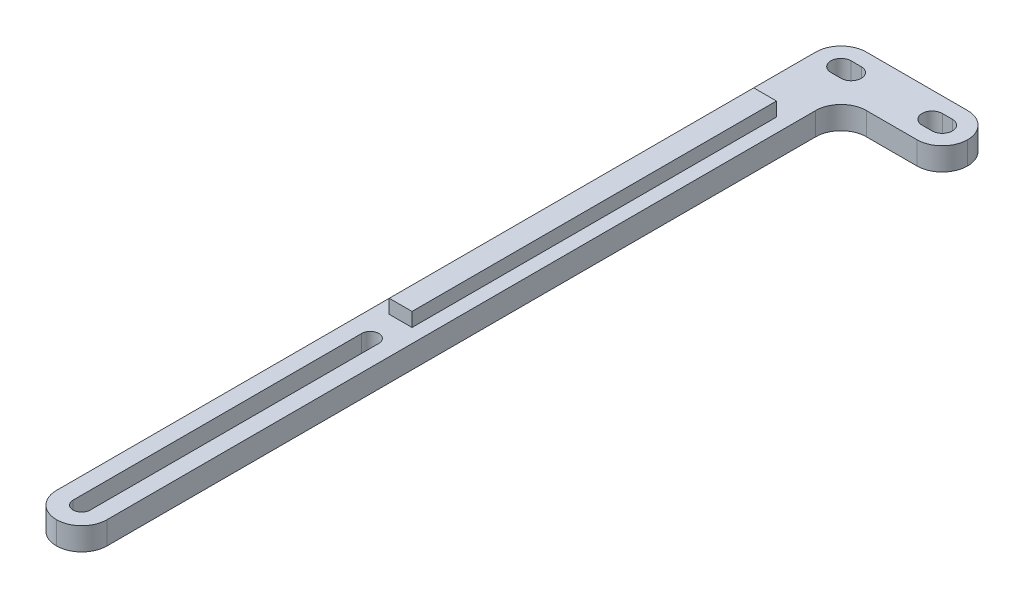
ISO-10303-21;
HEADER;
FILE_DESCRIPTION(('STEP AP214'),'2;1');
FILE_NAME('part.step','',(''),(''),'','','');
FILE_SCHEMA(('AUTOMOTIVE_DESIGN { 1 0 10303 214 1 1 1 1 }'));
ENDSEC;
DATA;
#1=APPLICATION_CONTEXT('core data for automotive mechanical design processes');
#2=APPLICATION_PROTOCOL_DEFINITION('international standard','automotive_design',2000,#1);
#3=PRODUCT_CONTEXT('',#1,'mechanical');
#4=PRODUCT('Part','Part','',(#3));
#5=PRODUCT_RELATED_PRODUCT_CATEGORY('part','',(#4));
#6=PRODUCT_DEFINITION_FORMATION('','',#4);
#7=PRODUCT_DEFINITION_CONTEXT('part definition',#1,'design');
#8=PRODUCT_DEFINITION('design','',#6,#7);
#9=PRODUCT_DEFINITION_SHAPE('','',#8);
#10=(LENGTH_UNIT() NAMED_UNIT(*) SI_UNIT(.MILLI.,.METRE.));
#11=(NAMED_UNIT(*) PLANE_ANGLE_UNIT() SI_UNIT($,.RADIAN.));
#12=(NAMED_UNIT(*) SI_UNIT($,.STERADIAN.) SOLID_ANGLE_UNIT());
#13=UNCERTAINTY_MEASURE_WITH_UNIT(LENGTH_MEASURE(1.E-05),#10,'distance_accuracy_value','');
#14=(GEOMETRIC_REPRESENTATION_CONTEXT(3) GLOBAL_UNCERTAINTY_ASSIGNED_CONTEXT((#13)) GLOBAL_UNIT_ASSIGNED_CONTEXT((#10,
#11,#12)) REPRESENTATION_CONTEXT('',''));
#15=CARTESIAN_POINT('',(0.,0.,0.));
#16=DIRECTION('',(0.,0.,1.));
#17=DIRECTION('',(1.,0.,0.));
#18=AXIS2_PLACEMENT_3D('',#15,#16,#17);
#19=CARTESIAN_POINT('',(5.,4.5,-13.5150335331905));
#20=DIRECTION('',(-1.,0.,0.));
#21=DIRECTION('',(0.,0.,1.));
#22=AXIS2_PLACEMENT_3D('',#19,#20,#21);
#23=PLANE('',#22);
#24=DIRECTION('',(0.,0.,-1.));
#25=VECTOR('',#24,1.);
#26=CARTESIAN_POINT('',(5.,4.5,-13.5150335331905));
#27=LINE('',#26,#25);
#28=CARTESIAN_POINT('',(5.,4.5,-18.5150335331905));
#29=VERTEX_POINT('',#28);
#30=CARTESIAN_POINT('',(5.,4.5,-158.51503353319));
#31=VERTEX_POINT('',#30);
#32=EDGE_CURVE('E358',#29,#31,#27,.T.);
#33=ORIENTED_EDGE('',*,*,#32,.F.);
#34=DIRECTION('',(0.,-1.,0.));
#35=VECTOR('',#34,1.);
#36=CARTESIAN_POINT('',(5.,4.5,-18.5150335331905));
#37=LINE('',#36,#35);
#38=CARTESIAN_POINT('',(5.,0.,-18.5150335331905));
#39=VERTEX_POINT('',#38);
#40=EDGE_CURVE('E405',#29,#39,#37,.T.);
#41=ORIENTED_EDGE('',*,*,#40,.T.);
#42=DIRECTION('',(0.,0.,-1.));
#43=VECTOR('',#42,1.);
#44=CARTESIAN_POINT('',(5.,0.,-13.5150335331905));
#45=LINE('',#44,#43);
#46=CARTESIAN_POINT('',(5.,0.,-158.51503353319));
#47=VERTEX_POINT('',#46);
#48=EDGE_CURVE('E357',#39,#47,#45,.T.);
#49=ORIENTED_EDGE('',*,*,#48,.T.);
#50=DIRECTION('',(0.,-1.,0.));
#51=VECTOR('',#50,1.);
#52=CARTESIAN_POINT('',(5.,4.5,-158.51503353319));
#53=LINE('',#52,#51);
#54=EDGE_CURVE('E385',#47,#31,#53,.F.);
#55=ORIENTED_EDGE('',*,*,#54,.T.);
#56=EDGE_LOOP('',(#33,#41,#49,#55));
#57=FACE_BOUND('',#56,.T.);
#58=ADVANCED_FACE('F43',(#57),#23,.F.);
#59=CARTESIAN_POINT('',(-5.,4.5,-173.51503353319));
#60=DIRECTION('',(0.,0.,1.));
#61=DIRECTION('',(1.,0.,0.));
#62=AXIS2_PLACEMENT_3D('',#59,#60,#61);
#63=PLANE('',#62);
#64=DIRECTION('',(-1.,0.,0.));
#65=VECTOR('',#64,1.);
#66=CARTESIAN_POINT('',(-5.,4.5,-173.51503353319));
#67=LINE('',#66,#65);
#68=CARTESIAN_POINT('',(20.,4.5,-173.51503353319));
#69=VERTEX_POINT('',#68);
#70=CARTESIAN_POINT('',(0.,4.5,-173.51503353319));
#71=VERTEX_POINT('',#70);
#72=EDGE_CURVE('E360',#69,#71,#67,.T.);
#73=ORIENTED_EDGE('',*,*,#72,.F.);
#74=DIRECTION('',(0.,1.,0.));
#75=VECTOR('',#74,1.);
#76=CARTESIAN_POINT('',(20.,4.5,-173.51503353319));
#77=LINE('',#76,#75);
#78=CARTESIAN_POINT('',(20.,0.,-173.51503353319));
#79=VERTEX_POINT('',#78);
#80=EDGE_CURVE('E413',#69,#79,#77,.F.);
#81=ORIENTED_EDGE('',*,*,#80,.T.);
#82=DIRECTION('',(-1.,0.,0.));
#83=VECTOR('',#82,1.);
#84=CARTESIAN_POINT('',(-5.,0.,-173.51503353319));
#85=LINE('',#84,#83);
#86=CARTESIAN_POINT('',(0.,0.,-173.51503353319));
#87=VERTEX_POINT('',#86);
#88=EDGE_CURVE('E368',#79,#87,#85,.T.);
#89=ORIENTED_EDGE('',*,*,#88,.T.);
#90=DIRECTION('',(0.,-1.,0.));
#91=VECTOR('',#90,1.);
#92=CARTESIAN_POINT('',(0.,4.5,-173.51503353319));
#93=LINE('',#92,#91);
#94=EDGE_CURVE('E377',#87,#71,#93,.F.);
#95=ORIENTED_EDGE('',*,*,#94,.T.);
#96=EDGE_LOOP('',(#73,#81,#89,#95));
#97=FACE_BOUND('',#96,.T.);
#98=ADVANCED_FACE('F492',(#97),#63,.F.);
#99=CARTESIAN_POINT('',(-5.,4.5,-13.5150335331905));
#100=DIRECTION('',(1.,0.,0.));
#101=DIRECTION('',(0.,0.,-1.));
#102=AXIS2_PLACEMENT_3D('',#99,#100,#101);
#103=PLANE('',#102);
#104=DIRECTION('',(0.,0.,1.));
#105=VECTOR('',#104,1.);
#106=CARTESIAN_POINT('',(-5.,0.,-13.5150335331905));
#107=LINE('',#106,#105);
#108=CARTESIAN_POINT('',(-5.,0.,-168.51503353319));
#109=VERTEX_POINT('',#108);
#110=CARTESIAN_POINT('',(-5.,0.,-18.5150335331905));
#111=VERTEX_POINT('',#110);
#112=EDGE_CURVE('E361',#109,#111,#107,.T.);
#113=ORIENTED_EDGE('',*,*,#112,.T.);
#114=DIRECTION('',(0.,-1.,0.));
#115=VECTOR('',#114,1.);
#116=CARTESIAN_POINT('',(-5.,4.5,-18.5150335331905));
#117=LINE('',#116,#115);
#118=CARTESIAN_POINT('',(-5.,4.5,-18.5150335331905));
#119=VERTEX_POINT('',#118);
#120=EDGE_CURVE('E398',#111,#119,#117,.F.);
#121=ORIENTED_EDGE('',*,*,#120,.T.);
#122=DIRECTION('',(0.,0.,1.));
#123=VECTOR('',#122,1.);
#124=CARTESIAN_POINT('',(-5.,4.5,-13.5150335331905));
#125=LINE('',#124,#123);
#126=CARTESIAN_POINT('',(-5.,4.5,-168.51503353319));
#127=VERTEX_POINT('',#126);
#128=EDGE_CURVE('E363',#127,#119,#125,.T.);
#129=ORIENTED_EDGE('',*,*,#128,.F.);
#130=DIRECTION('',(0.,-1.,0.));
#131=VECTOR('',#130,1.);
#132=CARTESIAN_POINT('',(-5.,4.5,-168.51503353319));
#133=LINE('',#132,#131);
#134=EDGE_CURVE('E366',#127,#109,#133,.T.);
#135=ORIENTED_EDGE('',*,*,#134,.T.);
#136=EDGE_LOOP('',(#113,#121,#129,#135));
#137=FACE_BOUND('',#136,.T.);
#138=ADVANCED_FACE('F500',(#137),#103,.F.);
#139=CARTESIAN_POINT('',(0.,4.5,0.));
#140=DIRECTION('',(0.,-1.,0.));
#141=DIRECTION('',(0.,0.,-1.));
#142=AXIS2_PLACEMENT_3D('',#139,#140,#141);
#143=PLANE('',#142);
#144=DIRECTION('',(0.,0.,1.));
#145=VECTOR('',#144,1.);
#146=CARTESIAN_POINT('',(2.25,4.5,0.));
#147=LINE('',#146,#145);
#148=CARTESIAN_POINT('',(2.25,4.5,-153.51503353319));
#149=VERTEX_POINT('',#148);
#150=CARTESIAN_POINT('',(2.25,4.5,-81.5150335331905));
#151=VERTEX_POINT('',#150);
#152=EDGE_CURVE('E63',#149,#151,#147,.T.);
#153=ORIENTED_EDGE('',*,*,#152,.T.);
#154=DIRECTION('',(-1.,0.,0.));
#155=VECTOR('',#154,1.);
#156=CARTESIAN_POINT('',(0.,4.5,-81.5150335331905));
#157=LINE('',#156,#155);
#158=CARTESIAN_POINT('',(-2.25,4.5,-81.5150335331905));
#159=VERTEX_POINT('',#158);
#160=EDGE_CURVE('E58',#151,#159,#157,.T.);
#161=ORIENTED_EDGE('',*,*,#160,.T.);
#162=DIRECTION('',(0.,0.,-1.));
#163=VECTOR('',#162,1.);
#164=CARTESIAN_POINT('',(-2.25,4.5,0.));
#165=LINE('',#164,#163);
#166=CARTESIAN_POINT('',(-2.25,4.5,-153.51503353319));
#167=VERTEX_POINT('',#166);
#168=EDGE_CURVE('E243',#159,#167,#165,.T.);
#169=ORIENTED_EDGE('',*,*,#168,.T.);
#170=DIRECTION('',(-1.,0.,0.));
#171=VECTOR('',#170,1.);
#172=CARTESIAN_POINT('',(0.,4.5,-153.51503353319));
#173=LINE('',#172,#171);
#174=EDGE_CURVE('E281',#149,#167,#173,.T.);
#175=ORIENTED_EDGE('',*,*,#174,.F.);
#176=EDGE_LOOP('',(#153,#161,#169,#175));
#177=FACE_BOUND('',#176,.T.);
#178=DIRECTION('',(0.,0.,-1.));
#179=VECTOR('',#178,1.);
#180=CARTESIAN_POINT('',(1.7,4.5,-18.5150335331905));
#181=LINE('',#180,#179);
#182=CARTESIAN_POINT('',(1.7,4.5,-18.5150335331905));
#183=VERTEX_POINT('',#182);
#184=CARTESIAN_POINT('',(1.7,4.5,-75.5150335331905));
#185=VERTEX_POINT('',#184);
#186=EDGE_CURVE('E294',#183,#185,#181,.T.);
#187=ORIENTED_EDGE('',*,*,#186,.F.);
#188=CARTESIAN_POINT('',(0.,4.5,-18.5150335331905));
#189=DIRECTION('',(0.,1.,0.));
#190=DIRECTION('',(0.,0.,1.));
#191=AXIS2_PLACEMENT_3D('',#188,#189,#190);
#192=CIRCLE('',#191,1.7);
#193=CARTESIAN_POINT('',(-1.7,4.5,-18.5150335331905));
#194=VERTEX_POINT('',#193);
#195=EDGE_CURVE('E292',#194,#183,#192,.T.);
#196=ORIENTED_EDGE('',*,*,#195,.F.);
#197=DIRECTION('',(0.,0.,1.));
#198=VECTOR('',#197,1.);
#199=CARTESIAN_POINT('',(-1.7,4.5,-18.5150335331905));
#200=LINE('',#199,#198);
#201=CARTESIAN_POINT('',(-1.7,4.5,-75.5150335331905));
#202=VERTEX_POINT('',#201);
#203=EDGE_CURVE('E301',#202,#194,#200,.T.);
#204=ORIENTED_EDGE('',*,*,#203,.F.);
#205=CARTESIAN_POINT('',(0.,4.5,-75.5150335331905));
#206=DIRECTION('',(0.,1.,0.));
#207=DIRECTION('',(0.,0.,1.));
#208=AXIS2_PLACEMENT_3D('',#205,#206,#207);
#209=CIRCLE('',#208,1.7);
#210=EDGE_CURVE('E298',#185,#202,#209,.T.);
#211=ORIENTED_EDGE('',*,*,#210,.F.);
#212=EDGE_LOOP('',(#187,#196,#204,#211));
#213=FACE_BOUND('',#212,.T.);
#214=DIRECTION('',(1.,0.,0.));
#215=VECTOR('',#214,1.);
#216=CARTESIAN_POINT('',(18.,4.5,-166.51503353319));
#217=LINE('',#216,#215);
#218=CARTESIAN_POINT('',(18.,4.5,-166.51503353319));
#219=VERTEX_POINT('',#218);
#220=CARTESIAN_POINT('',(20.,4.5,-166.51503353319));
#221=VERTEX_POINT('',#220);
#222=EDGE_CURVE('E330',#219,#221,#217,.T.);
#223=ORIENTED_EDGE('',*,*,#222,.F.);
#224=CARTESIAN_POINT('',(18.,4.5,-168.51503353319));
#225=DIRECTION('',(0.,1.,0.));
#226=DIRECTION('',(0.,0.,1.));
#227=AXIS2_PLACEMENT_3D('',#224,#225,#226);
#228=CIRCLE('',#227,2.);
#229=CARTESIAN_POINT('',(18.,4.5,-170.51503353319));
#230=VERTEX_POINT('',#229);
#231=EDGE_CURVE('E295',#230,#219,#228,.T.);
#232=ORIENTED_EDGE('',*,*,#231,.F.);
#233=DIRECTION('',(-1.,0.,0.));
#234=VECTOR('',#233,1.);
#235=CARTESIAN_POINT('',(18.,4.5,-170.51503353319));
#236=LINE('',#235,#234);
#237=CARTESIAN_POINT('',(20.,4.5,-170.51503353319));
#238=VERTEX_POINT('',#237);
#239=EDGE_CURVE('E317',#238,#230,#236,.T.);
#240=ORIENTED_EDGE('',*,*,#239,.F.);
#241=CARTESIAN_POINT('',(20.,4.5,-168.51503353319));
#242=DIRECTION('',(0.,1.,0.));
#243=DIRECTION('',(0.,0.,1.));
#244=AXIS2_PLACEMENT_3D('',#241,#242,#243);
#245=CIRCLE('',#244,2.);
#246=EDGE_CURVE('E327',#221,#238,#245,.T.);
#247=ORIENTED_EDGE('',*,*,#246,.F.);
#248=EDGE_LOOP('',(#223,#232,#240,#247));
#249=FACE_BOUND('',#248,.T.);
#250=DIRECTION('',(-1.,0.,0.));
#251=VECTOR('',#250,1.);
#252=CARTESIAN_POINT('',(2.,4.5,-170.51503353319));
#253=LINE('',#252,#251);
#254=CARTESIAN_POINT('',(2.,4.5,-170.51503353319));
#255=VERTEX_POINT('',#254);
#256=CARTESIAN_POINT('',(0.,4.5,-170.51503353319));
#257=VERTEX_POINT('',#256);
#258=EDGE_CURVE('E348',#255,#257,#253,.T.);
#259=ORIENTED_EDGE('',*,*,#258,.F.);
#260=CARTESIAN_POINT('',(2.,4.5,-168.51503353319));
#261=DIRECTION('',(0.,1.,0.));
#262=DIRECTION('',(0.,0.,1.));
#263=AXIS2_PLACEMENT_3D('',#260,#261,#262);
#264=CIRCLE('',#263,2.);
#265=CARTESIAN_POINT('',(2.,4.5,-166.51503353319));
#266=VERTEX_POINT('',#265);
#267=EDGE_CURVE('E324',#266,#255,#264,.T.);
#268=ORIENTED_EDGE('',*,*,#267,.F.);
#269=DIRECTION('',(1.,0.,0.));
#270=VECTOR('',#269,1.);
#271=CARTESIAN_POINT('',(2.,4.5,-166.51503353319));
#272=LINE('',#271,#270);
#273=CARTESIAN_POINT('',(0.,4.5,-166.51503353319));
#274=VERTEX_POINT('',#273);
#275=EDGE_CURVE('E337',#274,#266,#272,.T.);
#276=ORIENTED_EDGE('',*,*,#275,.F.);
#277=CARTESIAN_POINT('',(0.,4.5,-168.51503353319));
#278=DIRECTION('',(0.,1.,0.));
#279=DIRECTION('',(0.,0.,1.));
#280=AXIS2_PLACEMENT_3D('',#277,#278,#279);
#281=CIRCLE('',#280,2.);
#282=EDGE_CURVE('E345',#257,#274,#281,.T.);
#283=ORIENTED_EDGE('',*,*,#282,.F.);
#284=EDGE_LOOP('',(#259,#268,#276,#283));
#285=FACE_BOUND('',#284,.T.);
#286=CARTESIAN_POINT('',(20.,4.5,-168.51503353319));
#287=DIRECTION('',(0.,-1.,0.));
#288=DIRECTION('',(0.,0.,-1.));
#289=AXIS2_PLACEMENT_3D('',#286,#287,#288);
#290=CIRCLE('',#289,5.);
#291=CARTESIAN_POINT('',(20.,4.5,-163.51503353319));
#292=VERTEX_POINT('',#291);
#293=CARTESIAN_POINT('',(25.,4.5,-168.51503353319));
#294=VERTEX_POINT('',#293);
#295=EDGE_CURVE('E407',#292,#294,#290,.F.);
#296=ORIENTED_EDGE('',*,*,#295,.T.);
#297=CARTESIAN_POINT('',(20.,4.5,-168.51503353319));
#298=DIRECTION('',(0.,-1.,0.));
#299=DIRECTION('',(0.,0.,-1.));
#300=AXIS2_PLACEMENT_3D('',#297,#298,#299);
#301=CIRCLE('',#300,5.);
#302=EDGE_CURVE('E411',#294,#69,#301,.F.);
#303=ORIENTED_EDGE('',*,*,#302,.T.);
#304=ORIENTED_EDGE('',*,*,#72,.T.);
#305=CARTESIAN_POINT('',(0.,4.5,-168.51503353319));
#306=DIRECTION('',(0.,-1.,0.));
#307=DIRECTION('',(0.,0.,-1.));
#308=AXIS2_PLACEMENT_3D('',#305,#306,#307);
#309=CIRCLE('',#308,5.);
#310=EDGE_CURVE('E380',#71,#127,#309,.F.);
#311=ORIENTED_EDGE('',*,*,#310,.T.);
#312=ORIENTED_EDGE('',*,*,#128,.T.);
#313=CARTESIAN_POINT('',(0.,4.5,-18.5150335331905));
#314=DIRECTION('',(0.,-1.,0.));
#315=DIRECTION('',(0.,0.,-1.));
#316=AXIS2_PLACEMENT_3D('',#313,#314,#315);
#317=CIRCLE('',#316,5.);
#318=CARTESIAN_POINT('',(0.,4.5,-13.5150335331905));
#319=VERTEX_POINT('',#318);
#320=EDGE_CURVE('E403',#119,#319,#317,.F.);
#321=ORIENTED_EDGE('',*,*,#320,.T.);
#322=CARTESIAN_POINT('',(0.,4.5,-18.5150335331905));
#323=DIRECTION('',(0.,-1.,0.));
#324=DIRECTION('',(0.,0.,-1.));
#325=AXIS2_PLACEMENT_3D('',#322,#323,#324);
#326=CIRCLE('',#325,5.);
#327=EDGE_CURVE('E401',#319,#29,#326,.F.);
#328=ORIENTED_EDGE('',*,*,#327,.T.);
#329=ORIENTED_EDGE('',*,*,#32,.T.);
#330=CARTESIAN_POINT('',(10.,4.5,-158.51503353319));
#331=DIRECTION('',(0.,-1.,0.));
#332=DIRECTION('',(0.,0.,-1.));
#333=AXIS2_PLACEMENT_3D('',#330,#331,#332);
#334=CIRCLE('',#333,5.);
#335=CARTESIAN_POINT('',(10.,4.5,-163.51503353319));
#336=VERTEX_POINT('',#335);
#337=EDGE_CURVE('E391',#31,#336,#334,.T.);
#338=ORIENTED_EDGE('',*,*,#337,.T.);
#339=DIRECTION('',(-1.,0.,0.));
#340=VECTOR('',#339,1.);
#341=CARTESIAN_POINT('',(25.,4.5,-163.51503353319));
#342=LINE('',#341,#340);
#343=EDGE_CURVE('E354',#292,#336,#342,.T.);
#344=ORIENTED_EDGE('',*,*,#343,.F.);
#345=EDGE_LOOP('',(#296,#303,#304,#311,#312,#321,#328,#329,#338,#344));
#346=FACE_BOUND('',#345,.T.);
#347=ADVANCED_FACE('F546',(#177,#213,#249,#285,#346),#143,.F.);
#348=CARTESIAN_POINT('',(0.,0.,0.));
#349=DIRECTION('',(0.,-1.,0.));
#350=DIRECTION('',(0.,0.,-1.));
#351=AXIS2_PLACEMENT_3D('',#348,#349,#350);
#352=PLANE('',#351);
#353=DIRECTION('',(-1.,0.,0.));
#354=VECTOR('',#353,1.);
#355=CARTESIAN_POINT('',(0.,0.,-81.5150335331905));
#356=LINE('',#355,#354);
#357=CARTESIAN_POINT('',(2.25,0.,-81.5150335331905));
#358=VERTEX_POINT('',#357);
#359=CARTESIAN_POINT('',(-2.25,0.,-81.5150335331905));
#360=VERTEX_POINT('',#359);
#361=EDGE_CURVE('E11',#358,#360,#356,.T.);
#362=ORIENTED_EDGE('',*,*,#361,.F.);
#363=DIRECTION('',(0.,0.,1.));
#364=VECTOR('',#363,1.);
#365=CARTESIAN_POINT('',(2.25,0.,0.));
#366=LINE('',#365,#364);
#367=CARTESIAN_POINT('',(2.25,0.,-153.51503353319));
#368=VERTEX_POINT('',#367);
#369=EDGE_CURVE('E454',#368,#358,#366,.T.);
#370=ORIENTED_EDGE('',*,*,#369,.F.);
#371=DIRECTION('',(-1.,0.,0.));
#372=VECTOR('',#371,1.);
#373=CARTESIAN_POINT('',(0.,0.,-153.51503353319));
#374=LINE('',#373,#372);
#375=CARTESIAN_POINT('',(-2.25,0.,-153.51503353319));
#376=VERTEX_POINT('',#375);
#377=EDGE_CURVE('E451',#368,#376,#374,.T.);
#378=ORIENTED_EDGE('',*,*,#377,.T.);
#379=DIRECTION('',(0.,0.,-1.));
#380=VECTOR('',#379,1.);
#381=CARTESIAN_POINT('',(-2.25,0.,0.));
#382=LINE('',#381,#380);
#383=EDGE_CURVE('E51',#360,#376,#382,.T.);
#384=ORIENTED_EDGE('',*,*,#383,.F.);
#385=EDGE_LOOP('',(#362,#370,#378,#384));
#386=FACE_BOUND('',#385,.T.);
#387=CARTESIAN_POINT('',(0.,0.,-18.5150335331905));
#388=DIRECTION('',(0.,-1.,0.));
#389=DIRECTION('',(0.,0.,-1.));
#390=AXIS2_PLACEMENT_3D('',#387,#388,#389);
#391=CIRCLE('',#390,1.7);
#392=CARTESIAN_POINT('',(1.7,0.,-18.5150335331905));
#393=VERTEX_POINT('',#392);
#394=CARTESIAN_POINT('',(-1.7,0.,-18.5150335331905));
#395=VERTEX_POINT('',#394);
#396=EDGE_CURVE('E449',#393,#395,#391,.T.);
#397=ORIENTED_EDGE('',*,*,#396,.F.);
#398=DIRECTION('',(0.,0.,1.));
#399=VECTOR('',#398,1.);
#400=CARTESIAN_POINT('',(1.7,0.,0.));
#401=LINE('',#400,#399);
#402=CARTESIAN_POINT('',(1.7,0.,-75.5150335331905));
#403=VERTEX_POINT('',#402);
#404=EDGE_CURVE('E442',#403,#393,#401,.T.);
#405=ORIENTED_EDGE('',*,*,#404,.F.);
#406=CARTESIAN_POINT('',(0.,0.,-75.5150335331905));
#407=DIRECTION('',(0.,-1.,0.));
#408=DIRECTION('',(0.,0.,-1.));
#409=AXIS2_PLACEMENT_3D('',#406,#407,#408);
#410=CIRCLE('',#409,1.7);
#411=CARTESIAN_POINT('',(-1.7,0.,-75.5150335331905));
#412=VERTEX_POINT('',#411);
#413=EDGE_CURVE('E444',#412,#403,#410,.T.);
#414=ORIENTED_EDGE('',*,*,#413,.F.);
#415=DIRECTION('',(0.,0.,-1.));
#416=VECTOR('',#415,1.);
#417=CARTESIAN_POINT('',(-1.7,0.,0.));
#418=LINE('',#417,#416);
#419=EDGE_CURVE('E447',#395,#412,#418,.T.);
#420=ORIENTED_EDGE('',*,*,#419,.F.);
#421=EDGE_LOOP('',(#397,#405,#414,#420));
#422=FACE_BOUND('',#421,.T.);
#423=CARTESIAN_POINT('',(18.,0.,-168.51503353319));
#424=DIRECTION('',(0.,-1.,0.));
#425=DIRECTION('',(0.,0.,-1.));
#426=AXIS2_PLACEMENT_3D('',#423,#424,#425);
#427=CIRCLE('',#426,2.);
#428=CARTESIAN_POINT('',(18.,0.,-166.51503353319));
#429=VERTEX_POINT('',#428);
#430=CARTESIAN_POINT('',(18.,0.,-170.51503353319));
#431=VERTEX_POINT('',#430);
#432=EDGE_CURVE('E440',#429,#431,#427,.T.);
#433=ORIENTED_EDGE('',*,*,#432,.F.);
#434=DIRECTION('',(-1.,0.,0.));
#435=VECTOR('',#434,1.);
#436=CARTESIAN_POINT('',(0.,0.,-166.51503353319));
#437=LINE('',#436,#435);
#438=CARTESIAN_POINT('',(20.,0.,-166.51503353319));
#439=VERTEX_POINT('',#438);
#440=EDGE_CURVE('E433',#439,#429,#437,.T.);
#441=ORIENTED_EDGE('',*,*,#440,.F.);
#442=CARTESIAN_POINT('',(20.,0.,-168.51503353319));
#443=DIRECTION('',(0.,-1.,0.));
#444=DIRECTION('',(0.,0.,-1.));
#445=AXIS2_PLACEMENT_3D('',#442,#443,#444);
#446=CIRCLE('',#445,2.);
#447=CARTESIAN_POINT('',(20.,0.,-170.51503353319));
#448=VERTEX_POINT('',#447);
#449=EDGE_CURVE('E435',#448,#439,#446,.T.);
#450=ORIENTED_EDGE('',*,*,#449,.F.);
#451=DIRECTION('',(1.,0.,0.));
#452=VECTOR('',#451,1.);
#453=CARTESIAN_POINT('',(0.,0.,-170.51503353319));
#454=LINE('',#453,#452);
#455=EDGE_CURVE('E438',#431,#448,#454,.T.);
#456=ORIENTED_EDGE('',*,*,#455,.F.);
#457=EDGE_LOOP('',(#433,#441,#450,#456));
#458=FACE_BOUND('',#457,.T.);
#459=CARTESIAN_POINT('',(2.,0.,-168.51503353319));
#460=DIRECTION('',(0.,-1.,0.));
#461=DIRECTION('',(0.,0.,-1.));
#462=AXIS2_PLACEMENT_3D('',#459,#460,#461);
#463=CIRCLE('',#462,2.);
#464=CARTESIAN_POINT('',(2.,0.,-170.51503353319));
#465=VERTEX_POINT('',#464);
#466=CARTESIAN_POINT('',(2.,0.,-166.51503353319));
#467=VERTEX_POINT('',#466);
#468=EDGE_CURVE('E431',#465,#467,#463,.T.);
#469=ORIENTED_EDGE('',*,*,#468,.F.);
#470=DIRECTION('',(1.,0.,0.));
#471=VECTOR('',#470,1.);
#472=CARTESIAN_POINT('',(0.,0.,-170.51503353319));
#473=LINE('',#472,#471);
#474=CARTESIAN_POINT('',(0.,0.,-170.51503353319));
#475=VERTEX_POINT('',#474);
#476=EDGE_CURVE('E422',#475,#465,#473,.T.);
#477=ORIENTED_EDGE('',*,*,#476,.F.);
#478=CARTESIAN_POINT('',(0.,0.,-168.51503353319));
#479=DIRECTION('',(0.,-1.,0.));
#480=DIRECTION('',(0.,0.,-1.));
#481=AXIS2_PLACEMENT_3D('',#478,#479,#480);
#482=CIRCLE('',#481,2.);
#483=CARTESIAN_POINT('',(0.,0.,-166.51503353319));
#484=VERTEX_POINT('',#483);
#485=EDGE_CURVE('E426',#484,#475,#482,.T.);
#486=ORIENTED_EDGE('',*,*,#485,.F.);
#487=DIRECTION('',(-1.,0.,0.));
#488=VECTOR('',#487,1.);
#489=CARTESIAN_POINT('',(0.,0.,-166.51503353319));
#490=LINE('',#489,#488);
#491=EDGE_CURVE('E429',#467,#484,#490,.T.);
#492=ORIENTED_EDGE('',*,*,#491,.F.);
#493=EDGE_LOOP('',(#469,#477,#486,#492));
#494=FACE_BOUND('',#493,.T.);
#495=ORIENTED_EDGE('',*,*,#88,.F.);
#496=CARTESIAN_POINT('',(20.,0.,-168.51503353319));
#497=DIRECTION('',(0.,-1.,0.));
#498=DIRECTION('',(0.,0.,-1.));
#499=AXIS2_PLACEMENT_3D('',#496,#497,#498);
#500=CIRCLE('',#499,5.);
#501=CARTESIAN_POINT('',(25.,0.,-168.51503353319));
#502=VERTEX_POINT('',#501);
#503=EDGE_CURVE('E418',#79,#502,#500,.T.);
#504=ORIENTED_EDGE('',*,*,#503,.T.);
#505=CARTESIAN_POINT('',(20.,0.,-168.51503353319));
#506=DIRECTION('',(0.,-1.,0.));
#507=DIRECTION('',(0.,0.,-1.));
#508=AXIS2_PLACEMENT_3D('',#505,#506,#507);
#509=CIRCLE('',#508,5.);
#510=CARTESIAN_POINT('',(20.,0.,-163.51503353319));
#511=VERTEX_POINT('',#510);
#512=EDGE_CURVE('E416',#502,#511,#509,.T.);
#513=ORIENTED_EDGE('',*,*,#512,.T.);
#514=DIRECTION('',(-1.,0.,0.));
#515=VECTOR('',#514,1.);
#516=CARTESIAN_POINT('',(25.,0.,-163.51503353319));
#517=LINE('',#516,#515);
#518=CARTESIAN_POINT('',(10.,0.,-163.51503353319));
#519=VERTEX_POINT('',#518);
#520=EDGE_CURVE('E352',#511,#519,#517,.T.);
#521=ORIENTED_EDGE('',*,*,#520,.T.);
#522=CARTESIAN_POINT('',(10.,0.,-158.51503353319));
#523=DIRECTION('',(0.,-1.,0.));
#524=DIRECTION('',(0.,0.,-1.));
#525=AXIS2_PLACEMENT_3D('',#522,#523,#524);
#526=CIRCLE('',#525,5.);
#527=EDGE_CURVE('E388',#519,#47,#526,.F.);
#528=ORIENTED_EDGE('',*,*,#527,.T.);
#529=ORIENTED_EDGE('',*,*,#48,.F.);
#530=CARTESIAN_POINT('',(0.,0.,-18.5150335331905));
#531=DIRECTION('',(0.,-1.,0.));
#532=DIRECTION('',(0.,0.,-1.));
#533=AXIS2_PLACEMENT_3D('',#530,#531,#532);
#534=CIRCLE('',#533,5.);
#535=CARTESIAN_POINT('',(0.,0.,-13.5150335331905));
#536=VERTEX_POINT('',#535);
#537=EDGE_CURVE('E394',#39,#536,#534,.T.);
#538=ORIENTED_EDGE('',*,*,#537,.T.);
#539=CARTESIAN_POINT('',(0.,0.,-18.5150335331905));
#540=DIRECTION('',(0.,-1.,0.));
#541=DIRECTION('',(0.,0.,-1.));
#542=AXIS2_PLACEMENT_3D('',#539,#540,#541);
#543=CIRCLE('',#542,5.);
#544=EDGE_CURVE('E396',#536,#111,#543,.T.);
#545=ORIENTED_EDGE('',*,*,#544,.T.);
#546=ORIENTED_EDGE('',*,*,#112,.F.);
#547=CARTESIAN_POINT('',(0.,0.,-168.51503353319));
#548=DIRECTION('',(0.,-1.,0.));
#549=DIRECTION('',(0.,0.,-1.));
#550=AXIS2_PLACEMENT_3D('',#547,#548,#549);
#551=CIRCLE('',#550,5.);
#552=EDGE_CURVE('E374',#109,#87,#551,.T.);
#553=ORIENTED_EDGE('',*,*,#552,.T.);
#554=EDGE_LOOP('',(#495,#504,#513,#521,#528,#529,#538,#545,#546,#553));
#555=FACE_BOUND('',#554,.T.);
#556=ADVANCED_FACE('F464',(#386,#422,#458,#494,#555),#352,.T.);
#557=CARTESIAN_POINT('',(25.,4.5,-163.51503353319));
#558=DIRECTION('',(0.,0.,-1.));
#559=DIRECTION('',(-1.,0.,0.));
#560=AXIS2_PLACEMENT_3D('',#557,#558,#559);
#561=PLANE('',#560);
#562=ORIENTED_EDGE('',*,*,#520,.F.);
#563=DIRECTION('',(0.,-1.,0.));
#564=VECTOR('',#563,1.);
#565=CARTESIAN_POINT('',(20.,4.5,-163.51503353319));
#566=LINE('',#565,#564);
#567=EDGE_CURVE('E420',#511,#292,#566,.F.);
#568=ORIENTED_EDGE('',*,*,#567,.T.);
#569=ORIENTED_EDGE('',*,*,#343,.T.);
#570=DIRECTION('',(0.,-1.,0.));
#571=VECTOR('',#570,1.);
#572=CARTESIAN_POINT('',(10.,0.,-163.51503353319));
#573=LINE('',#572,#571);
#574=EDGE_CURVE('E382',#336,#519,#573,.T.);
#575=ORIENTED_EDGE('',*,*,#574,.T.);
#576=EDGE_LOOP('',(#562,#568,#569,#575));
#577=FACE_BOUND('',#576,.T.);
#578=ADVANCED_FACE('F510',(#577),#561,.F.);
#579=CARTESIAN_POINT('',(0.,4.5,-168.51503353319));
#580=DIRECTION('',(0.,-1.,0.));
#581=DIRECTION('',(0.,0.,-1.));
#582=AXIS2_PLACEMENT_3D('',#579,#580,#581);
#583=CYLINDRICAL_SURFACE('',#582,5.);
#584=ORIENTED_EDGE('',*,*,#310,.F.);
#585=ORIENTED_EDGE('',*,*,#94,.F.);
#586=ORIENTED_EDGE('',*,*,#552,.F.);
#587=ORIENTED_EDGE('',*,*,#134,.F.);
#588=EDGE_LOOP('',(#584,#585,#586,#587));
#589=FACE_BOUND('',#588,.T.);
#590=ADVANCED_FACE('F506',(#589),#583,.T.);
#591=CARTESIAN_POINT('',(10.,4.5,-158.51503353319));
#592=DIRECTION('',(0.,1.,0.));
#593=DIRECTION('',(0.,0.,1.));
#594=AXIS2_PLACEMENT_3D('',#591,#592,#593);
#595=CYLINDRICAL_SURFACE('',#594,5.);
#596=ORIENTED_EDGE('',*,*,#337,.F.);
#597=ORIENTED_EDGE('',*,*,#54,.F.);
#598=ORIENTED_EDGE('',*,*,#527,.F.);
#599=ORIENTED_EDGE('',*,*,#574,.F.);
#600=EDGE_LOOP('',(#596,#597,#598,#599));
#601=FACE_BOUND('',#600,.T.);
#602=ADVANCED_FACE('F509',(#601),#595,.F.);
#603=CARTESIAN_POINT('',(0.,4.5,-18.5150335331905));
#604=DIRECTION('',(0.,-1.,0.));
#605=DIRECTION('',(0.,0.,-1.));
#606=AXIS2_PLACEMENT_3D('',#603,#604,#605);
#607=CYLINDRICAL_SURFACE('',#606,5.);
#608=ORIENTED_EDGE('',*,*,#40,.F.);
#609=ORIENTED_EDGE('',*,*,#327,.F.);
#610=DIRECTION('',(0.,-1.,0.));
#611=VECTOR('',#610,1.);
#612=CARTESIAN_POINT('',(0.,4.5,-13.5150335331905));
#613=LINE('',#612,#611);
#614=EDGE_CURVE('E355',#536,#319,#613,.F.);
#615=ORIENTED_EDGE('',*,*,#614,.F.);
#616=ORIENTED_EDGE('',*,*,#537,.F.);
#617=EDGE_LOOP('',(#608,#609,#615,#616));
#618=FACE_BOUND('',#617,.T.);
#619=ADVANCED_FACE('F513',(#618),#607,.T.);
#620=CARTESIAN_POINT('',(0.,4.5,-18.5150335331905));
#621=DIRECTION('',(0.,-1.,0.));
#622=DIRECTION('',(0.,0.,-1.));
#623=AXIS2_PLACEMENT_3D('',#620,#621,#622);
#624=CYLINDRICAL_SURFACE('',#623,5.);
#625=ORIENTED_EDGE('',*,*,#320,.F.);
#626=ORIENTED_EDGE('',*,*,#120,.F.);
#627=ORIENTED_EDGE('',*,*,#544,.F.);
#628=ORIENTED_EDGE('',*,*,#614,.T.);
#629=EDGE_LOOP('',(#625,#626,#627,#628));
#630=FACE_BOUND('',#629,.T.);
#631=ADVANCED_FACE('F515',(#630),#624,.T.);
#632=CARTESIAN_POINT('',(20.,0.,-168.51503353319));
#633=DIRECTION('',(0.,-1.,0.));
#634=DIRECTION('',(0.,0.,-1.));
#635=AXIS2_PLACEMENT_3D('',#632,#633,#634);
#636=CYLINDRICAL_SURFACE('',#635,5.);
#637=ORIENTED_EDGE('',*,*,#567,.F.);
#638=ORIENTED_EDGE('',*,*,#512,.F.);
#639=DIRECTION('',(0.,-1.,0.));
#640=VECTOR('',#639,1.);
#641=CARTESIAN_POINT('',(25.,0.,-168.51503353319));
#642=LINE('',#641,#640);
#643=EDGE_CURVE('E307',#294,#502,#642,.T.);
#644=ORIENTED_EDGE('',*,*,#643,.F.);
#645=ORIENTED_EDGE('',*,*,#295,.F.);
#646=EDGE_LOOP('',(#637,#638,#644,#645));
#647=FACE_BOUND('',#646,.T.);
#648=ADVANCED_FACE('F45',(#647),#636,.T.);
#649=CARTESIAN_POINT('',(20.,0.,-168.51503353319));
#650=DIRECTION('',(0.,1.,0.));
#651=DIRECTION('',(0.,0.,1.));
#652=AXIS2_PLACEMENT_3D('',#649,#650,#651);
#653=CYLINDRICAL_SURFACE('',#652,5.);
#654=ORIENTED_EDGE('',*,*,#503,.F.);
#655=ORIENTED_EDGE('',*,*,#80,.F.);
#656=ORIENTED_EDGE('',*,*,#302,.F.);
#657=ORIENTED_EDGE('',*,*,#643,.T.);
#658=EDGE_LOOP('',(#654,#655,#656,#657));
#659=FACE_BOUND('',#658,.T.);
#660=ADVANCED_FACE('F521',(#659),#653,.T.);
#661=CARTESIAN_POINT('',(2.,-25.5,-168.51503353319));
#662=DIRECTION('',(0.,1.,0.));
#663=DIRECTION('',(0.,0.,1.));
#664=AXIS2_PLACEMENT_3D('',#661,#662,#663);
#665=CYLINDRICAL_SURFACE('',#664,2.);
#666=ORIENTED_EDGE('',*,*,#468,.T.);
#667=DIRECTION('',(0.,1.,0.));
#668=VECTOR('',#667,1.);
#669=CARTESIAN_POINT('',(2.,-25.5,-166.51503353319));
#670=LINE('',#669,#668);
#671=EDGE_CURVE('E291',#467,#266,#670,.T.);
#672=ORIENTED_EDGE('',*,*,#671,.T.);
#673=ORIENTED_EDGE('',*,*,#267,.T.);
#674=DIRECTION('',(0.,1.,0.));
#675=VECTOR('',#674,1.);
#676=CARTESIAN_POINT('',(2.,-25.5,-170.51503353319));
#677=LINE('',#676,#675);
#678=EDGE_CURVE('E334',#465,#255,#677,.T.);
#679=ORIENTED_EDGE('',*,*,#678,.F.);
#680=EDGE_LOOP('',(#666,#672,#673,#679));
#681=FACE_BOUND('',#680,.T.);
#682=ADVANCED_FACE('F523',(#681),#665,.F.);
#683=CARTESIAN_POINT('',(2.,-25.5,-166.51503353319));
#684=DIRECTION('',(0.,0.,1.));
#685=DIRECTION('',(1.,0.,0.));
#686=AXIS2_PLACEMENT_3D('',#683,#684,#685);
#687=PLANE('',#686);
#688=ORIENTED_EDGE('',*,*,#491,.T.);
#689=DIRECTION('',(0.,1.,0.));
#690=VECTOR('',#689,1.);
#691=CARTESIAN_POINT('',(0.,-25.5,-166.51503353319));
#692=LINE('',#691,#690);
#693=EDGE_CURVE('E340',#484,#274,#692,.T.);
#694=ORIENTED_EDGE('',*,*,#693,.T.);
#695=ORIENTED_EDGE('',*,*,#275,.T.);
#696=ORIENTED_EDGE('',*,*,#671,.F.);
#697=EDGE_LOOP('',(#688,#694,#695,#696));
#698=FACE_BOUND('',#697,.T.);
#699=ADVANCED_FACE('F529',(#698),#687,.F.);
#700=CARTESIAN_POINT('',(0.,-25.5,-168.51503353319));
#701=DIRECTION('',(0.,1.,0.));
#702=DIRECTION('',(0.,0.,1.));
#703=AXIS2_PLACEMENT_3D('',#700,#701,#702);
#704=CYLINDRICAL_SURFACE('',#703,2.);
#705=ORIENTED_EDGE('',*,*,#485,.T.);
#706=DIRECTION('',(0.,1.,0.));
#707=VECTOR('',#706,1.);
#708=CARTESIAN_POINT('',(0.,-25.5,-170.51503353319));
#709=LINE('',#708,#707);
#710=EDGE_CURVE('E338',#475,#257,#709,.T.);
#711=ORIENTED_EDGE('',*,*,#710,.T.);
#712=ORIENTED_EDGE('',*,*,#282,.T.);
#713=ORIENTED_EDGE('',*,*,#693,.F.);
#714=EDGE_LOOP('',(#705,#711,#712,#713));
#715=FACE_BOUND('',#714,.T.);
#716=ADVANCED_FACE('F654',(#715),#704,.F.);
#717=CARTESIAN_POINT('',(2.,-25.5,-170.51503353319));
#718=DIRECTION('',(0.,0.,-1.));
#719=DIRECTION('',(-1.,0.,0.));
#720=AXIS2_PLACEMENT_3D('',#717,#718,#719);
#721=PLANE('',#720);
#722=ORIENTED_EDGE('',*,*,#476,.T.);
#723=ORIENTED_EDGE('',*,*,#678,.T.);
#724=ORIENTED_EDGE('',*,*,#258,.T.);
#725=ORIENTED_EDGE('',*,*,#710,.F.);
#726=EDGE_LOOP('',(#722,#723,#724,#725));
#727=FACE_BOUND('',#726,.T.);
#728=ADVANCED_FACE('F662',(#727),#721,.F.);
#729=CARTESIAN_POINT('',(18.,-25.5,-168.51503353319));
#730=DIRECTION('',(0.,1.,0.));
#731=DIRECTION('',(0.,0.,1.));
#732=AXIS2_PLACEMENT_3D('',#729,#730,#731);
#733=CYLINDRICAL_SURFACE('',#732,2.);
#734=ORIENTED_EDGE('',*,*,#432,.T.);
#735=DIRECTION('',(0.,1.,0.));
#736=VECTOR('',#735,1.);
#737=CARTESIAN_POINT('',(18.,-25.5,-170.51503353319));
#738=LINE('',#737,#736);
#739=EDGE_CURVE('E322',#431,#230,#738,.T.);
#740=ORIENTED_EDGE('',*,*,#739,.T.);
#741=ORIENTED_EDGE('',*,*,#231,.T.);
#742=DIRECTION('',(0.,1.,0.));
#743=VECTOR('',#742,1.);
#744=CARTESIAN_POINT('',(18.,-25.5,-166.51503353319));
#745=LINE('',#744,#743);
#746=EDGE_CURVE('E314',#429,#219,#745,.T.);
#747=ORIENTED_EDGE('',*,*,#746,.F.);
#748=EDGE_LOOP('',(#734,#740,#741,#747));
#749=FACE_BOUND('',#748,.T.);
#750=ADVANCED_FACE('F670',(#749),#733,.F.);
#751=CARTESIAN_POINT('',(18.,-25.5,-170.51503353319));
#752=DIRECTION('',(0.,0.,-1.));
#753=DIRECTION('',(-1.,0.,0.));
#754=AXIS2_PLACEMENT_3D('',#751,#752,#753);
#755=PLANE('',#754);
#756=ORIENTED_EDGE('',*,*,#455,.T.);
#757=DIRECTION('',(0.,1.,0.));
#758=VECTOR('',#757,1.);
#759=CARTESIAN_POINT('',(20.,-25.5,-170.51503353319));
#760=LINE('',#759,#758);
#761=EDGE_CURVE('E320',#448,#238,#760,.T.);
#762=ORIENTED_EDGE('',*,*,#761,.T.);
#763=ORIENTED_EDGE('',*,*,#239,.T.);
#764=ORIENTED_EDGE('',*,*,#739,.F.);
#765=EDGE_LOOP('',(#756,#762,#763,#764));
#766=FACE_BOUND('',#765,.T.);
#767=ADVANCED_FACE('F679',(#766),#755,.F.);
#768=CARTESIAN_POINT('',(20.,-25.5,-168.51503353319));
#769=DIRECTION('',(0.,1.,0.));
#770=DIRECTION('',(0.,0.,1.));
#771=AXIS2_PLACEMENT_3D('',#768,#769,#770);
#772=CYLINDRICAL_SURFACE('',#771,2.);
#773=ORIENTED_EDGE('',*,*,#449,.T.);
#774=DIRECTION('',(0.,1.,0.));
#775=VECTOR('',#774,1.);
#776=CARTESIAN_POINT('',(20.,-25.5,-166.51503353319));
#777=LINE('',#776,#775);
#778=EDGE_CURVE('E318',#439,#221,#777,.T.);
#779=ORIENTED_EDGE('',*,*,#778,.T.);
#780=ORIENTED_EDGE('',*,*,#246,.T.);
#781=ORIENTED_EDGE('',*,*,#761,.F.);
#782=EDGE_LOOP('',(#773,#779,#780,#781));
#783=FACE_BOUND('',#782,.T.);
#784=ADVANCED_FACE('F688',(#783),#772,.F.);
#785=CARTESIAN_POINT('',(18.,-25.5,-166.51503353319));
#786=DIRECTION('',(0.,0.,1.));
#787=DIRECTION('',(1.,0.,0.));
#788=AXIS2_PLACEMENT_3D('',#785,#786,#787);
#789=PLANE('',#788);
#790=ORIENTED_EDGE('',*,*,#440,.T.);
#791=ORIENTED_EDGE('',*,*,#746,.T.);
#792=ORIENTED_EDGE('',*,*,#222,.T.);
#793=ORIENTED_EDGE('',*,*,#778,.F.);
#794=EDGE_LOOP('',(#790,#791,#792,#793));
#795=FACE_BOUND('',#794,.T.);
#796=ADVANCED_FACE('F697',(#795),#789,.F.);
#797=CARTESIAN_POINT('',(0.,-25.5,-18.5150335331905));
#798=DIRECTION('',(0.,1.,0.));
#799=DIRECTION('',(0.,0.,1.));
#800=AXIS2_PLACEMENT_3D('',#797,#798,#799);
#801=CYLINDRICAL_SURFACE('',#800,1.7);
#802=ORIENTED_EDGE('',*,*,#396,.T.);
#803=DIRECTION('',(0.,1.,0.));
#804=VECTOR('',#803,1.);
#805=CARTESIAN_POINT('',(-1.7,-25.5,-18.5150335331905));
#806=LINE('',#805,#804);
#807=EDGE_CURVE('E305',#395,#194,#806,.T.);
#808=ORIENTED_EDGE('',*,*,#807,.T.);
#809=ORIENTED_EDGE('',*,*,#195,.T.);
#810=DIRECTION('',(0.,1.,0.));
#811=VECTOR('',#810,1.);
#812=CARTESIAN_POINT('',(1.7,-25.5,-18.5150335331905));
#813=LINE('',#812,#811);
#814=EDGE_CURVE('E304',#393,#183,#813,.T.);
#815=ORIENTED_EDGE('',*,*,#814,.F.);
#816=EDGE_LOOP('',(#802,#808,#809,#815));
#817=FACE_BOUND('',#816,.T.);
#818=ADVANCED_FACE('F706',(#817),#801,.F.);
#819=CARTESIAN_POINT('',(-1.7,-25.5,-18.5150335331905));
#820=DIRECTION('',(-1.,0.,0.));
#821=DIRECTION('',(0.,0.,1.));
#822=AXIS2_PLACEMENT_3D('',#819,#820,#821);
#823=PLANE('',#822);
#824=ORIENTED_EDGE('',*,*,#419,.T.);
#825=DIRECTION('',(0.,1.,0.));
#826=VECTOR('',#825,1.);
#827=CARTESIAN_POINT('',(-1.7,-25.5,-75.5150335331905));
#828=LINE('',#827,#826);
#829=EDGE_CURVE('E308',#412,#202,#828,.T.);
#830=ORIENTED_EDGE('',*,*,#829,.T.);
#831=ORIENTED_EDGE('',*,*,#203,.T.);
#832=ORIENTED_EDGE('',*,*,#807,.F.);
#833=EDGE_LOOP('',(#824,#830,#831,#832));
#834=FACE_BOUND('',#833,.T.);
#835=ADVANCED_FACE('F715',(#834),#823,.F.);
#836=CARTESIAN_POINT('',(0.,-25.5,-75.5150335331905));
#837=DIRECTION('',(0.,1.,0.));
#838=DIRECTION('',(0.,0.,1.));
#839=AXIS2_PLACEMENT_3D('',#836,#837,#838);
#840=CYLINDRICAL_SURFACE('',#839,1.7);
#841=ORIENTED_EDGE('',*,*,#413,.T.);
#842=DIRECTION('',(0.,1.,0.));
#843=VECTOR('',#842,1.);
#844=CARTESIAN_POINT('',(1.7,-25.5,-75.5150335331905));
#845=LINE('',#844,#843);
#846=EDGE_CURVE('E310',#403,#185,#845,.T.);
#847=ORIENTED_EDGE('',*,*,#846,.T.);
#848=ORIENTED_EDGE('',*,*,#210,.T.);
#849=ORIENTED_EDGE('',*,*,#829,.F.);
#850=EDGE_LOOP('',(#841,#847,#848,#849));
#851=FACE_BOUND('',#850,.T.);
#852=ADVANCED_FACE('F724',(#851),#840,.F.);
#853=CARTESIAN_POINT('',(1.7,-25.5,-18.5150335331905));
#854=DIRECTION('',(1.,0.,0.));
#855=DIRECTION('',(0.,0.,-1.));
#856=AXIS2_PLACEMENT_3D('',#853,#854,#855);
#857=PLANE('',#856);
#858=ORIENTED_EDGE('',*,*,#404,.T.);
#859=ORIENTED_EDGE('',*,*,#814,.T.);
#860=ORIENTED_EDGE('',*,*,#186,.T.);
#861=ORIENTED_EDGE('',*,*,#846,.F.);
#862=EDGE_LOOP('',(#858,#859,#860,#861));
#863=FACE_BOUND('',#862,.T.);
#864=ADVANCED_FACE('F487',(#863),#857,.F.);
#865=CARTESIAN_POINT('',(2.25,-2.75,-81.5150335331905));
#866=DIRECTION('',(0.,-1.,0.));
#867=DIRECTION('',(0.,0.,-1.));
#868=AXIS2_PLACEMENT_3D('',#865,#866,#867);
#869=PLANE('',#868);
#870=DIRECTION('',(-1.,0.,0.));
#871=VECTOR('',#870,1.);
#872=CARTESIAN_POINT('',(2.25,-2.75,-153.51503353319));
#873=LINE('',#872,#871);
#874=CARTESIAN_POINT('',(2.25,-2.75,-153.51503353319));
#875=VERTEX_POINT('',#874);
#876=CARTESIAN_POINT('',(-2.25,-2.75,-153.51503353319));
#877=VERTEX_POINT('',#876);
#878=EDGE_CURVE('E247',#875,#877,#873,.T.);
#879=ORIENTED_EDGE('',*,*,#878,.F.);
#880=DIRECTION('',(0.,0.,-1.));
#881=VECTOR('',#880,1.);
#882=CARTESIAN_POINT('',(2.25,-2.75,-81.5150335331905));
#883=LINE('',#882,#881);
#884=CARTESIAN_POINT('',(2.25,-2.75,-81.5150335331905));
#885=VERTEX_POINT('',#884);
#886=EDGE_CURVE('E282',#885,#875,#883,.T.);
#887=ORIENTED_EDGE('',*,*,#886,.F.);
#888=DIRECTION('',(-1.,0.,0.));
#889=VECTOR('',#888,1.);
#890=CARTESIAN_POINT('',(2.25,-2.75,-81.5150335331905));
#891=LINE('',#890,#889);
#892=CARTESIAN_POINT('',(-2.25,-2.75,-81.5150335331905));
#893=VERTEX_POINT('',#892);
#894=EDGE_CURVE('E256',#885,#893,#891,.T.);
#895=ORIENTED_EDGE('',*,*,#894,.T.);
#896=DIRECTION('',(0.,0.,-1.));
#897=VECTOR('',#896,1.);
#898=CARTESIAN_POINT('',(-2.25,-2.75,-81.5150335331905));
#899=LINE('',#898,#897);
#900=EDGE_CURVE('E279',#893,#877,#899,.T.);
#901=ORIENTED_EDGE('',*,*,#900,.T.);
#902=EDGE_LOOP('',(#879,#887,#895,#901));
#903=FACE_BOUND('',#902,.T.);
#904=ADVANCED_FACE('F476',(#903),#869,.T.);
#905=CARTESIAN_POINT('',(0.,0.,-81.5150335331905));
#906=DIRECTION('',(0.,0.,1.));
#907=DIRECTION('',(1.,0.,0.));
#908=AXIS2_PLACEMENT_3D('',#905,#906,#907);
#909=PLANE('',#908);
#910=DIRECTION('',(0.,-1.,0.));
#911=VECTOR('',#910,1.);
#912=CARTESIAN_POINT('',(2.25,-2.75,-81.5150335331905));
#913=LINE('',#912,#911);
#914=EDGE_CURVE('E262',#358,#885,#913,.T.);
#915=ORIENTED_EDGE('',*,*,#914,.F.);
#916=ORIENTED_EDGE('',*,*,#361,.T.);
#917=DIRECTION('',(0.,1.,0.));
#918=VECTOR('',#917,1.);
#919=CARTESIAN_POINT('',(-2.25,-2.75,-81.5150335331905));
#920=LINE('',#919,#918);
#921=EDGE_CURVE('E246',#893,#360,#920,.T.);
#922=ORIENTED_EDGE('',*,*,#921,.F.);
#923=ORIENTED_EDGE('',*,*,#894,.F.);
#924=EDGE_LOOP('',(#915,#916,#922,#923));
#925=FACE_BOUND('',#924,.T.);
#926=ADVANCED_FACE('F478',(#925),#909,.T.);
#927=CARTESIAN_POINT('',(0.,0.,-153.51503353319));
#928=DIRECTION('',(0.,0.,1.));
#929=DIRECTION('',(1.,0.,0.));
#930=AXIS2_PLACEMENT_3D('',#927,#928,#929);
#931=PLANE('',#930);
#932=ORIENTED_EDGE('',*,*,#377,.F.);
#933=DIRECTION('',(0.,-1.,0.));
#934=VECTOR('',#933,1.);
#935=CARTESIAN_POINT('',(2.25,-2.75,-153.51503353319));
#936=LINE('',#935,#934);
#937=EDGE_CURVE('E273',#368,#875,#936,.T.);
#938=ORIENTED_EDGE('',*,*,#937,.T.);
#939=ORIENTED_EDGE('',*,*,#878,.T.);
#940=DIRECTION('',(0.,1.,0.));
#941=VECTOR('',#940,1.);
#942=CARTESIAN_POINT('',(-2.25,-2.75,-153.51503353319));
#943=LINE('',#942,#941);
#944=EDGE_CURVE('E269',#877,#376,#943,.T.);
#945=ORIENTED_EDGE('',*,*,#944,.T.);
#946=EDGE_LOOP('',(#932,#938,#939,#945));
#947=FACE_BOUND('',#946,.T.);
#948=ADVANCED_FACE('F468',(#947),#931,.F.);
#949=CARTESIAN_POINT('',(2.25,-2.75,-81.5150335331905));
#950=DIRECTION('',(1.,0.,0.));
#951=DIRECTION('',(0.,0.,-1.));
#952=AXIS2_PLACEMENT_3D('',#949,#950,#951);
#953=PLANE('',#952);
#954=ORIENTED_EDGE('',*,*,#937,.F.);
#955=ORIENTED_EDGE('',*,*,#369,.T.);
#956=ORIENTED_EDGE('',*,*,#914,.T.);
#957=ORIENTED_EDGE('',*,*,#886,.T.);
#958=EDGE_LOOP('',(#954,#955,#956,#957));
#959=FACE_BOUND('',#958,.T.);
#960=ADVANCED_FACE('F470',(#959),#953,.T.);
#961=CARTESIAN_POINT('',(-2.25,-2.75,-81.5150335331905));
#962=DIRECTION('',(-1.,0.,0.));
#963=DIRECTION('',(0.,0.,1.));
#964=AXIS2_PLACEMENT_3D('',#961,#962,#963);
#965=PLANE('',#964);
#966=ORIENTED_EDGE('',*,*,#921,.T.);
#967=ORIENTED_EDGE('',*,*,#383,.T.);
#968=ORIENTED_EDGE('',*,*,#944,.F.);
#969=ORIENTED_EDGE('',*,*,#900,.F.);
#970=EDGE_LOOP('',(#966,#967,#968,#969));
#971=FACE_BOUND('',#970,.T.);
#972=ADVANCED_FACE('F459',(#971),#965,.T.);
#973=ORIENTED_EDGE('',*,*,#168,.F.);
#974=CARTESIAN_POINT('',(-2.25,7.25,-81.5150335331905));
#975=VERTEX_POINT('',#974);
#976=EDGE_CURVE('E237',#159,#975,#920,.T.);
#977=ORIENTED_EDGE('',*,*,#976,.T.);
#978=DIRECTION('',(0.,0.,-1.));
#979=VECTOR('',#978,1.);
#980=CARTESIAN_POINT('',(-2.25,7.25,-81.5150335331905));
#981=LINE('',#980,#979);
#982=CARTESIAN_POINT('',(-2.25,7.25,-153.51503353319));
#983=VERTEX_POINT('',#982);
#984=EDGE_CURVE('E241',#975,#983,#981,.T.);
#985=ORIENTED_EDGE('',*,*,#984,.T.);
#986=EDGE_CURVE('E271',#167,#983,#943,.T.);
#987=ORIENTED_EDGE('',*,*,#986,.F.);
#988=EDGE_LOOP('',(#973,#977,#985,#987));
#989=FACE_BOUND('',#988,.T.);
#990=ADVANCED_FACE('F239',(#989),#965,.T.);
#991=ORIENTED_EDGE('',*,*,#152,.F.);
#992=CARTESIAN_POINT('',(2.25,7.25,-153.51503353319));
#993=VERTEX_POINT('',#992);
#994=EDGE_CURVE('E274',#993,#149,#936,.T.);
#995=ORIENTED_EDGE('',*,*,#994,.F.);
#996=DIRECTION('',(0.,0.,-1.));
#997=VECTOR('',#996,1.);
#998=CARTESIAN_POINT('',(2.25,7.25,-81.5150335331905));
#999=LINE('',#998,#997);
#1000=CARTESIAN_POINT('',(2.25,7.25,-81.5150335331905));
#1001=VERTEX_POINT('',#1000);
#1002=EDGE_CURVE('E255',#1001,#993,#999,.T.);
#1003=ORIENTED_EDGE('',*,*,#1002,.F.);
#1004=EDGE_CURVE('E261',#1001,#151,#913,.T.);
#1005=ORIENTED_EDGE('',*,*,#1004,.T.);
#1006=EDGE_LOOP('',(#991,#995,#1003,#1005));
#1007=FACE_BOUND('',#1006,.T.);
#1008=ADVANCED_FACE('F490',(#1007),#953,.T.);
#1009=ORIENTED_EDGE('',*,*,#160,.F.);
#1010=ORIENTED_EDGE('',*,*,#1004,.F.);
#1011=DIRECTION('',(1.,0.,0.));
#1012=VECTOR('',#1011,1.);
#1013=CARTESIAN_POINT('',(2.25,7.25,-81.5150335331905));
#1014=LINE('',#1013,#1012);
#1015=EDGE_CURVE('E252',#975,#1001,#1014,.T.);
#1016=ORIENTED_EDGE('',*,*,#1015,.F.);
#1017=ORIENTED_EDGE('',*,*,#976,.F.);
#1018=EDGE_LOOP('',(#1009,#1010,#1016,#1017));
#1019=FACE_BOUND('',#1018,.T.);
#1020=ADVANCED_FACE('F259',(#1019),#909,.T.);
#1021=ORIENTED_EDGE('',*,*,#994,.T.);
#1022=ORIENTED_EDGE('',*,*,#174,.T.);
#1023=ORIENTED_EDGE('',*,*,#986,.T.);
#1024=DIRECTION('',(1.,0.,0.));
#1025=VECTOR('',#1024,1.);
#1026=CARTESIAN_POINT('',(2.25,7.25,-153.51503353319));
#1027=LINE('',#1026,#1025);
#1028=EDGE_CURVE('E254',#983,#993,#1027,.T.);
#1029=ORIENTED_EDGE('',*,*,#1028,.T.);
#1030=EDGE_LOOP('',(#1021,#1022,#1023,#1029));
#1031=FACE_BOUND('',#1030,.T.);
#1032=ADVANCED_FACE('F486',(#1031),#931,.F.);
#1033=CARTESIAN_POINT('',(2.25,7.25,-81.5150335331905));
#1034=DIRECTION('',(0.,1.,0.));
#1035=DIRECTION('',(0.,0.,1.));
#1036=AXIS2_PLACEMENT_3D('',#1033,#1034,#1035);
#1037=PLANE('',#1036);
#1038=ORIENTED_EDGE('',*,*,#1028,.F.);
#1039=ORIENTED_EDGE('',*,*,#984,.F.);
#1040=ORIENTED_EDGE('',*,*,#1015,.T.);
#1041=ORIENTED_EDGE('',*,*,#1002,.T.);
#1042=EDGE_LOOP('',(#1038,#1039,#1040,#1041));
#1043=FACE_BOUND('',#1042,.T.);
#1044=ADVANCED_FACE('F251',(#1043),#1037,.T.);
#1045=CLOSED_SHELL('',(#58,#98,#138,#347,#556,#578,#590,#602,#619,#631,#648,#660,#682,#699,#716,
#728,#750,#767,#784,#796,#818,#835,#852,#864,#904,#926,#948,#960,#972,#990,#1008,#1020,#1032,#1044));
#1046=MANIFOLD_SOLID_BREP('B2',#1045);
#1047=ADVANCED_BREP_SHAPE_REPRESENTATION('',(#18,#1046),#14);
#1048=SHAPE_DEFINITION_REPRESENTATION(#9,#1047);
ENDSEC;
END-ISO-10303-21;
